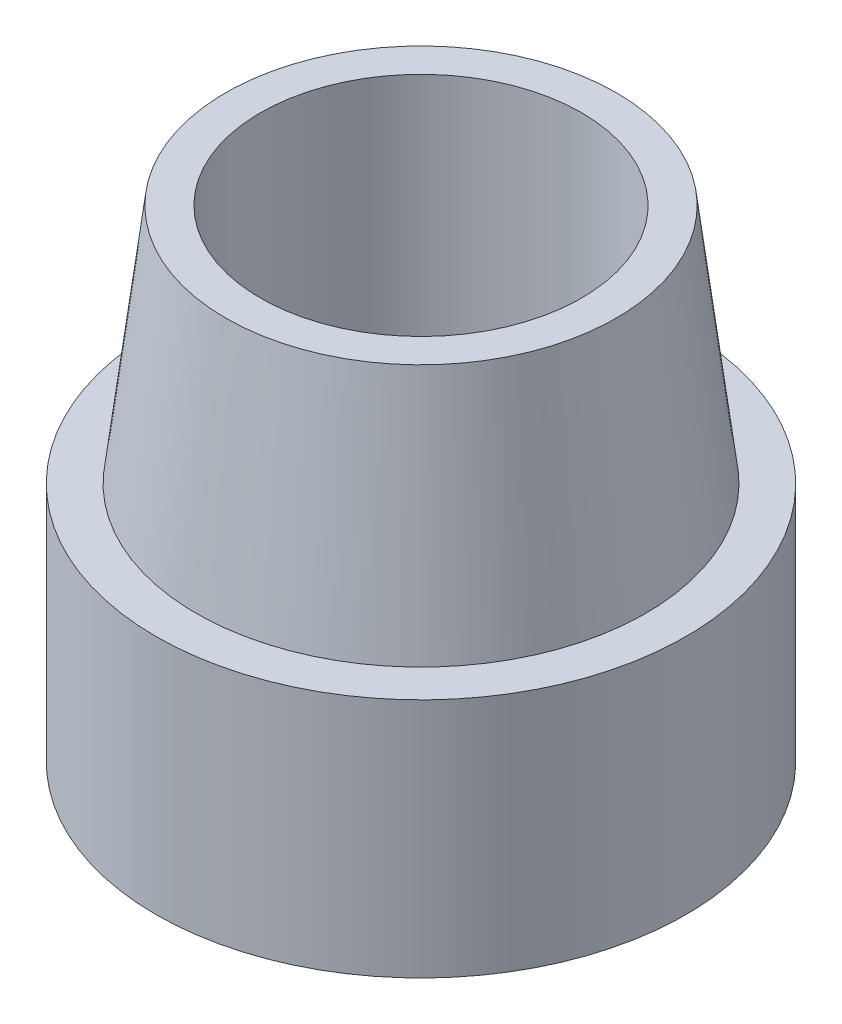
ISO-10303-21;
HEADER;
FILE_DESCRIPTION(('STEP AP214'),'2;1');
FILE_NAME('part.step','',(''),(''),'','','');
FILE_SCHEMA(('AUTOMOTIVE_DESIGN { 1 0 10303 214 1 1 1 1 }'));
ENDSEC;
DATA;
#1=APPLICATION_CONTEXT('core data for automotive mechanical design processes');
#2=APPLICATION_PROTOCOL_DEFINITION('international standard','automotive_design',2000,#1);
#3=PRODUCT_CONTEXT('',#1,'mechanical');
#4=PRODUCT('Part','Part','',(#3));
#5=PRODUCT_RELATED_PRODUCT_CATEGORY('part','',(#4));
#6=PRODUCT_DEFINITION_FORMATION('','',#4);
#7=PRODUCT_DEFINITION_CONTEXT('part definition',#1,'design');
#8=PRODUCT_DEFINITION('design','',#6,#7);
#9=PRODUCT_DEFINITION_SHAPE('','',#8);
#10=(LENGTH_UNIT() NAMED_UNIT(*) SI_UNIT(.MILLI.,.METRE.));
#11=(NAMED_UNIT(*) PLANE_ANGLE_UNIT() SI_UNIT($,.RADIAN.));
#12=(NAMED_UNIT(*) SI_UNIT($,.STERADIAN.) SOLID_ANGLE_UNIT());
#13=UNCERTAINTY_MEASURE_WITH_UNIT(LENGTH_MEASURE(1.E-05),#10,'distance_accuracy_value','');
#14=(GEOMETRIC_REPRESENTATION_CONTEXT(3) GLOBAL_UNCERTAINTY_ASSIGNED_CONTEXT((#13)) GLOBAL_UNIT_ASSIGNED_CONTEXT((#10,
#11,#12)) REPRESENTATION_CONTEXT('',''));
#15=CARTESIAN_POINT('',(0.,0.,0.));
#16=DIRECTION('',(0.,0.,1.));
#17=DIRECTION('',(1.,0.,0.));
#18=AXIS2_PLACEMENT_3D('',#15,#16,#17);
#19=CARTESIAN_POINT('',(10.,0.,0.));
#20=DIRECTION('',(0.,-1.,0.));
#21=DIRECTION('',(0.,0.,-1.));
#22=AXIS2_PLACEMENT_3D('',#19,#20,#21);
#23=PLANE('',#22);
#24=CARTESIAN_POINT('',(0.,0.,0.));
#25=DIRECTION('',(0.,-1.,0.));
#26=DIRECTION('',(0.,0.,-1.));
#27=AXIS2_PLACEMENT_3D('',#24,#25,#26);
#28=CIRCLE('',#27,16.5);
#29=CARTESIAN_POINT('',(0.,0.,-16.5));
#30=VERTEX_POINT('',#29);
#31=EDGE_CURVE('E10',#30,#30,#28,.T.);
#32=ORIENTED_EDGE('',*,*,#31,.T.);
#33=EDGE_LOOP('',(#32));
#34=FACE_BOUND('',#33,.T.);
#35=CARTESIAN_POINT('',(0.,0.,0.));
#36=DIRECTION('',(0.,-1.,0.));
#37=DIRECTION('',(0.,0.,-1.));
#38=AXIS2_PLACEMENT_3D('',#35,#36,#37);
#39=CIRCLE('',#38,10.);
#40=CARTESIAN_POINT('',(0.,0.,-10.));
#41=VERTEX_POINT('',#40);
#42=EDGE_CURVE('E52',#41,#41,#39,.T.);
#43=ORIENTED_EDGE('',*,*,#42,.F.);
#44=EDGE_LOOP('',(#43));
#45=FACE_BOUND('',#44,.T.);
#46=ADVANCED_FACE('F30',(#34,#45),#23,.T.);
#47=CARTESIAN_POINT('',(0.,0.,0.));
#48=DIRECTION('',(0.,-1.,0.));
#49=DIRECTION('',(0.,0.,-1.));
#50=AXIS2_PLACEMENT_3D('',#47,#48,#49);
#51=CYLINDRICAL_SURFACE('',#50,16.5);
#52=CARTESIAN_POINT('',(0.,15.,0.));
#53=DIRECTION('',(0.,-1.,0.));
#54=DIRECTION('',(0.,0.,-1.));
#55=AXIS2_PLACEMENT_3D('',#52,#53,#54);
#56=CIRCLE('',#55,16.5);
#57=CARTESIAN_POINT('',(0.,15.,-16.5));
#58=VERTEX_POINT('',#57);
#59=EDGE_CURVE('E36',#58,#58,#56,.T.);
#60=ORIENTED_EDGE('',*,*,#59,.T.);
#61=EDGE_LOOP('',(#60));
#62=FACE_BOUND('',#61,.T.);
#63=ORIENTED_EDGE('',*,*,#31,.F.);
#64=EDGE_LOOP('',(#63));
#65=FACE_BOUND('',#64,.T.);
#66=ADVANCED_FACE('F60',(#62,#65),#51,.T.);
#67=CARTESIAN_POINT('',(16.5,15.,0.));
#68=DIRECTION('',(0.,1.,0.));
#69=DIRECTION('',(0.,0.,1.));
#70=AXIS2_PLACEMENT_3D('',#67,#68,#69);
#71=PLANE('',#70);
#72=CARTESIAN_POINT('',(0.,15.,0.));
#73=DIRECTION('',(0.,-1.,0.));
#74=DIRECTION('',(0.,0.,-1.));
#75=AXIS2_PLACEMENT_3D('',#72,#73,#74);
#76=CIRCLE('',#75,14.0017684135435);
#77=CARTESIAN_POINT('',(0.,15.,-14.0017684135435));
#78=VERTEX_POINT('',#77);
#79=EDGE_CURVE('E40',#78,#78,#76,.T.);
#80=ORIENTED_EDGE('',*,*,#79,.T.);
#81=EDGE_LOOP('',(#80));
#82=FACE_BOUND('',#81,.T.);
#83=ORIENTED_EDGE('',*,*,#59,.F.);
#84=EDGE_LOOP('',(#83));
#85=FACE_BOUND('',#84,.T.);
#86=ADVANCED_FACE('F64',(#82,#85),#71,.T.);
#87=CARTESIAN_POINT('',(0.,15.,0.));
#88=DIRECTION('',(0.,-1.,0.));
#89=DIRECTION('',(0.,0.,-1.));
#90=AXIS2_PLACEMENT_3D('',#87,#88,#89);
#91=CONICAL_SURFACE('',#90,14.0017684135435,0.1221730476396);
#92=CARTESIAN_POINT('',(0.,30.,0.));
#93=DIRECTION('',(0.,-1.,0.));
#94=DIRECTION('',(0.,0.,-1.));
#95=AXIS2_PLACEMENT_3D('',#92,#93,#94);
#96=CIRCLE('',#95,12.16);
#97=CARTESIAN_POINT('',(0.,30.,-12.16));
#98=VERTEX_POINT('',#97);
#99=EDGE_CURVE('E44',#98,#98,#96,.T.);
#100=ORIENTED_EDGE('',*,*,#99,.T.);
#101=EDGE_LOOP('',(#100));
#102=FACE_BOUND('',#101,.T.);
#103=ORIENTED_EDGE('',*,*,#79,.F.);
#104=EDGE_LOOP('',(#103));
#105=FACE_BOUND('',#104,.T.);
#106=ADVANCED_FACE('F68',(#102,#105),#91,.T.);
#107=CARTESIAN_POINT('',(12.16,30.,0.));
#108=DIRECTION('',(0.,1.,0.));
#109=DIRECTION('',(0.,0.,1.));
#110=AXIS2_PLACEMENT_3D('',#107,#108,#109);
#111=PLANE('',#110);
#112=CARTESIAN_POINT('',(0.,30.,0.));
#113=DIRECTION('',(0.,-1.,0.));
#114=DIRECTION('',(0.,0.,-1.));
#115=AXIS2_PLACEMENT_3D('',#112,#113,#114);
#116=CIRCLE('',#115,10.);
#117=CARTESIAN_POINT('',(0.,30.,-10.));
#118=VERTEX_POINT('',#117);
#119=EDGE_CURVE('E49',#118,#118,#116,.T.);
#120=ORIENTED_EDGE('',*,*,#119,.T.);
#121=EDGE_LOOP('',(#120));
#122=FACE_BOUND('',#121,.T.);
#123=ORIENTED_EDGE('',*,*,#99,.F.);
#124=EDGE_LOOP('',(#123));
#125=FACE_BOUND('',#124,.T.);
#126=ADVANCED_FACE('F75',(#122,#125),#111,.T.);
#127=CARTESIAN_POINT('',(0.,0.,0.));
#128=DIRECTION('',(0.,-1.,0.));
#129=DIRECTION('',(0.,0.,-1.));
#130=AXIS2_PLACEMENT_3D('',#127,#128,#129);
#131=CYLINDRICAL_SURFACE('',#130,10.);
#132=ORIENTED_EDGE('',*,*,#42,.T.);
#133=EDGE_LOOP('',(#132));
#134=FACE_BOUND('',#133,.T.);
#135=ORIENTED_EDGE('',*,*,#119,.F.);
#136=EDGE_LOOP('',(#135));
#137=FACE_BOUND('',#136,.T.);
#138=ADVANCED_FACE('F56',(#134,#137),#131,.F.);
#139=CLOSED_SHELL('',(#46,#66,#86,#106,#126,#138));
#140=MANIFOLD_SOLID_BREP('B2',#139);
#141=ADVANCED_BREP_SHAPE_REPRESENTATION('',(#18,#140),#14);
#142=SHAPE_DEFINITION_REPRESENTATION(#9,#141);
ENDSEC;
END-ISO-10303-21;
